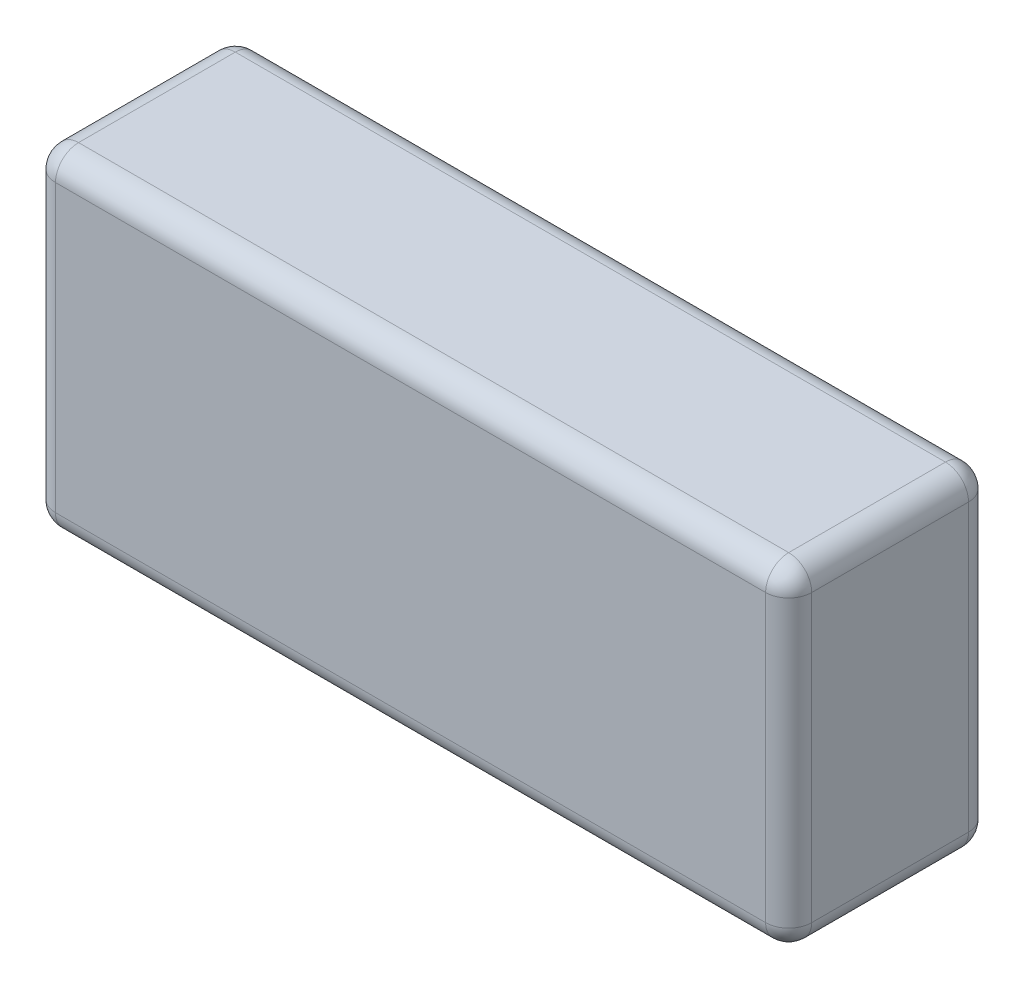
ISO-10303-21;
HEADER;
FILE_DESCRIPTION(('STEP AP214'),'2;1');
FILE_NAME('part.step','',(''),(''),'','','');
FILE_SCHEMA(('AUTOMOTIVE_DESIGN { 1 0 10303 214 1 1 1 1 }'));
ENDSEC;
DATA;
#1=APPLICATION_CONTEXT('core data for automotive mechanical design processes');
#2=APPLICATION_PROTOCOL_DEFINITION('international standard','automotive_design',2000,#1);
#3=PRODUCT_CONTEXT('',#1,'mechanical');
#4=PRODUCT('Part','Part','',(#3));
#5=PRODUCT_RELATED_PRODUCT_CATEGORY('part','',(#4));
#6=PRODUCT_DEFINITION_FORMATION('','',#4);
#7=PRODUCT_DEFINITION_CONTEXT('part definition',#1,'design');
#8=PRODUCT_DEFINITION('design','',#6,#7);
#9=PRODUCT_DEFINITION_SHAPE('','',#8);
#10=(LENGTH_UNIT() NAMED_UNIT(*) SI_UNIT(.MILLI.,.METRE.));
#11=(NAMED_UNIT(*) PLANE_ANGLE_UNIT() SI_UNIT($,.RADIAN.));
#12=(NAMED_UNIT(*) SI_UNIT($,.STERADIAN.) SOLID_ANGLE_UNIT());
#13=UNCERTAINTY_MEASURE_WITH_UNIT(LENGTH_MEASURE(1.E-05),#10,'distance_accuracy_value','');
#14=(GEOMETRIC_REPRESENTATION_CONTEXT(3) GLOBAL_UNCERTAINTY_ASSIGNED_CONTEXT((#13)) GLOBAL_UNIT_ASSIGNED_CONTEXT((#10,
#11,#12)) REPRESENTATION_CONTEXT('',''));
#15=CARTESIAN_POINT('',(0.,0.,0.));
#16=DIRECTION('',(0.,0.,1.));
#17=DIRECTION('',(1.,0.,0.));
#18=AXIS2_PLACEMENT_3D('',#15,#16,#17);
#19=CARTESIAN_POINT('',(0.,0.,22.));
#20=DIRECTION('',(1.,0.,0.));
#21=DIRECTION('',(0.,0.,-1.));
#22=AXIS2_PLACEMENT_3D('',#19,#20,#21);
#23=PLANE('',#22);
#24=DIRECTION('',(0.,0.,-1.));
#25=VECTOR('',#24,1.);
#26=CARTESIAN_POINT('',(0.,2.5,22.));
#27=LINE('',#26,#25);
#28=CARTESIAN_POINT('',(0.,2.5,2.5));
#29=VERTEX_POINT('',#28);
#30=CARTESIAN_POINT('',(0.,2.5,19.5));
#31=VERTEX_POINT('',#30);
#32=EDGE_CURVE('E256',#29,#31,#27,.F.);
#33=ORIENTED_EDGE('',*,*,#32,.T.);
#34=DIRECTION('',(0.,-1.,0.));
#35=VECTOR('',#34,1.);
#36=CARTESIAN_POINT('',(0.,0.,19.5));
#37=LINE('',#36,#35);
#38=CARTESIAN_POINT('',(0.,33.5,19.5));
#39=VERTEX_POINT('',#38);
#40=EDGE_CURVE('E269',#31,#39,#37,.F.);
#41=ORIENTED_EDGE('',*,*,#40,.T.);
#42=DIRECTION('',(0.,0.,-1.));
#43=VECTOR('',#42,1.);
#44=CARTESIAN_POINT('',(0.,33.5,22.));
#45=LINE('',#44,#43);
#46=CARTESIAN_POINT('',(0.,33.5,2.5));
#47=VERTEX_POINT('',#46);
#48=EDGE_CURVE('E262',#39,#47,#45,.T.);
#49=ORIENTED_EDGE('',*,*,#48,.T.);
#50=DIRECTION('',(0.,-1.,0.));
#51=VECTOR('',#50,1.);
#52=CARTESIAN_POINT('',(0.,2.5,2.5));
#53=LINE('',#52,#51);
#54=EDGE_CURVE('E214',#47,#29,#53,.T.);
#55=ORIENTED_EDGE('',*,*,#54,.T.);
#56=EDGE_LOOP('',(#33,#41,#49,#55));
#57=FACE_BOUND('',#56,.T.);
#58=ADVANCED_FACE('F35',(#57),#23,.F.);
#59=CARTESIAN_POINT('',(0.,0.,22.));
#60=DIRECTION('',(0.,1.,0.));
#61=DIRECTION('',(0.,0.,1.));
#62=AXIS2_PLACEMENT_3D('',#59,#60,#61);
#63=PLANE('',#62);
#64=DIRECTION('',(1.,0.,0.));
#65=VECTOR('',#64,1.);
#66=CARTESIAN_POINT('',(82.,0.,2.5));
#67=LINE('',#66,#65);
#68=CARTESIAN_POINT('',(2.5,0.,2.5));
#69=VERTEX_POINT('',#68);
#70=CARTESIAN_POINT('',(79.5,0.,2.5));
#71=VERTEX_POINT('',#70);
#72=EDGE_CURVE('E130',#69,#71,#67,.T.);
#73=ORIENTED_EDGE('',*,*,#72,.T.);
#74=DIRECTION('',(0.,0.,-1.));
#75=VECTOR('',#74,1.);
#76=CARTESIAN_POINT('',(79.5,0.,22.));
#77=LINE('',#76,#75);
#78=CARTESIAN_POINT('',(79.5,0.,19.5));
#79=VERTEX_POINT('',#78);
#80=EDGE_CURVE('E11',#71,#79,#77,.F.);
#81=ORIENTED_EDGE('',*,*,#80,.T.);
#82=DIRECTION('',(1.,0.,0.));
#83=VECTOR('',#82,1.);
#84=CARTESIAN_POINT('',(0.,0.,19.5));
#85=LINE('',#84,#83);
#86=CARTESIAN_POINT('',(2.5,0.,19.5));
#87=VERTEX_POINT('',#86);
#88=EDGE_CURVE('E128',#79,#87,#85,.F.);
#89=ORIENTED_EDGE('',*,*,#88,.T.);
#90=DIRECTION('',(0.,0.,-1.));
#91=VECTOR('',#90,1.);
#92=CARTESIAN_POINT('',(2.5,0.,22.));
#93=LINE('',#92,#91);
#94=EDGE_CURVE('E44',#87,#69,#93,.T.);
#95=ORIENTED_EDGE('',*,*,#94,.T.);
#96=EDGE_LOOP('',(#73,#81,#89,#95));
#97=FACE_BOUND('',#96,.T.);
#98=ADVANCED_FACE('F127',(#97),#63,.F.);
#99=CARTESIAN_POINT('',(82.,0.,22.));
#100=DIRECTION('',(-1.,0.,0.));
#101=DIRECTION('',(0.,0.,1.));
#102=AXIS2_PLACEMENT_3D('',#99,#100,#101);
#103=PLANE('',#102);
#104=DIRECTION('',(0.,0.,-1.));
#105=VECTOR('',#104,1.);
#106=CARTESIAN_POINT('',(82.,33.5,22.));
#107=LINE('',#106,#105);
#108=CARTESIAN_POINT('',(82.,33.5,2.5));
#109=VERTEX_POINT('',#108);
#110=CARTESIAN_POINT('',(82.,33.5,19.5));
#111=VERTEX_POINT('',#110);
#112=EDGE_CURVE('E52',#109,#111,#107,.F.);
#113=ORIENTED_EDGE('',*,*,#112,.T.);
#114=DIRECTION('',(0.,1.,0.));
#115=VECTOR('',#114,1.);
#116=CARTESIAN_POINT('',(82.,0.,19.5));
#117=LINE('',#116,#115);
#118=CARTESIAN_POINT('',(82.,2.5,19.5));
#119=VERTEX_POINT('',#118);
#120=EDGE_CURVE('E239',#111,#119,#117,.F.);
#121=ORIENTED_EDGE('',*,*,#120,.T.);
#122=DIRECTION('',(0.,0.,-1.));
#123=VECTOR('',#122,1.);
#124=CARTESIAN_POINT('',(82.,2.5,22.));
#125=LINE('',#124,#123);
#126=CARTESIAN_POINT('',(82.,2.5,2.5));
#127=VERTEX_POINT('',#126);
#128=EDGE_CURVE('E157',#119,#127,#125,.T.);
#129=ORIENTED_EDGE('',*,*,#128,.T.);
#130=DIRECTION('',(0.,1.,0.));
#131=VECTOR('',#130,1.);
#132=CARTESIAN_POINT('',(82.,33.5,2.5));
#133=LINE('',#132,#131);
#134=EDGE_CURVE('E57',#127,#109,#133,.T.);
#135=ORIENTED_EDGE('',*,*,#134,.T.);
#136=EDGE_LOOP('',(#113,#121,#129,#135));
#137=FACE_BOUND('',#136,.T.);
#138=ADVANCED_FACE('F334',(#137),#103,.F.);
#139=CARTESIAN_POINT('',(0.,36.,22.));
#140=DIRECTION('',(0.,-1.,0.));
#141=DIRECTION('',(0.,0.,-1.));
#142=AXIS2_PLACEMENT_3D('',#139,#140,#141);
#143=PLANE('',#142);
#144=DIRECTION('',(-1.,0.,0.));
#145=VECTOR('',#144,1.);
#146=CARTESIAN_POINT('',(0.,36.,2.5));
#147=LINE('',#146,#145);
#148=CARTESIAN_POINT('',(79.5,36.,2.5));
#149=VERTEX_POINT('',#148);
#150=CARTESIAN_POINT('',(2.5,36.,2.5));
#151=VERTEX_POINT('',#150);
#152=EDGE_CURVE('E153',#149,#151,#147,.T.);
#153=ORIENTED_EDGE('',*,*,#152,.T.);
#154=DIRECTION('',(0.,0.,-1.));
#155=VECTOR('',#154,1.);
#156=CARTESIAN_POINT('',(2.5,36.,22.));
#157=LINE('',#156,#155);
#158=CARTESIAN_POINT('',(2.5,36.,19.5));
#159=VERTEX_POINT('',#158);
#160=EDGE_CURVE('E227',#151,#159,#157,.F.);
#161=ORIENTED_EDGE('',*,*,#160,.T.);
#162=DIRECTION('',(-1.,0.,0.));
#163=VECTOR('',#162,1.);
#164=CARTESIAN_POINT('',(0.,36.,19.5));
#165=LINE('',#164,#163);
#166=CARTESIAN_POINT('',(79.5,36.,19.5));
#167=VERTEX_POINT('',#166);
#168=EDGE_CURVE('E280',#159,#167,#165,.F.);
#169=ORIENTED_EDGE('',*,*,#168,.T.);
#170=DIRECTION('',(0.,0.,-1.));
#171=VECTOR('',#170,1.);
#172=CARTESIAN_POINT('',(79.5,36.,22.));
#173=LINE('',#172,#171);
#174=EDGE_CURVE('E275',#167,#149,#173,.T.);
#175=ORIENTED_EDGE('',*,*,#174,.T.);
#176=EDGE_LOOP('',(#153,#161,#169,#175));
#177=FACE_BOUND('',#176,.T.);
#178=ADVANCED_FACE('F279',(#177),#143,.F.);
#179=CARTESIAN_POINT('',(0.,0.,22.));
#180=DIRECTION('',(0.,0.,-1.));
#181=DIRECTION('',(-1.,0.,0.));
#182=AXIS2_PLACEMENT_3D('',#179,#180,#181);
#183=PLANE('',#182);
#184=DIRECTION('',(-1.,0.,0.));
#185=VECTOR('',#184,1.);
#186=CARTESIAN_POINT('',(0.,33.5,22.));
#187=LINE('',#186,#185);
#188=CARTESIAN_POINT('',(79.5,33.5,22.));
#189=VERTEX_POINT('',#188);
#190=CARTESIAN_POINT('',(2.5,33.5,22.));
#191=VERTEX_POINT('',#190);
#192=EDGE_CURVE('E299',#189,#191,#187,.T.);
#193=ORIENTED_EDGE('',*,*,#192,.T.);
#194=DIRECTION('',(0.,-1.,0.));
#195=VECTOR('',#194,1.);
#196=CARTESIAN_POINT('',(2.5,0.,22.));
#197=LINE('',#196,#195);
#198=CARTESIAN_POINT('',(2.5,2.5,22.));
#199=VERTEX_POINT('',#198);
#200=EDGE_CURVE('E260',#191,#199,#197,.T.);
#201=ORIENTED_EDGE('',*,*,#200,.T.);
#202=DIRECTION('',(1.,0.,0.));
#203=VECTOR('',#202,1.);
#204=CARTESIAN_POINT('',(0.,2.5,22.));
#205=LINE('',#204,#203);
#206=CARTESIAN_POINT('',(79.5,2.5,22.));
#207=VERTEX_POINT('',#206);
#208=EDGE_CURVE('E288',#199,#207,#205,.T.);
#209=ORIENTED_EDGE('',*,*,#208,.T.);
#210=DIRECTION('',(0.,1.,0.));
#211=VECTOR('',#210,1.);
#212=CARTESIAN_POINT('',(79.5,0.,22.));
#213=LINE('',#212,#211);
#214=EDGE_CURVE('E264',#207,#189,#213,.T.);
#215=ORIENTED_EDGE('',*,*,#214,.T.);
#216=EDGE_LOOP('',(#193,#201,#209,#215));
#217=FACE_BOUND('',#216,.T.);
#218=ADVANCED_FACE('F298',(#217),#183,.F.);
#219=CARTESIAN_POINT('',(0.,0.,0.));
#220=DIRECTION('',(0.,0.,-1.));
#221=DIRECTION('',(-1.,0.,0.));
#222=AXIS2_PLACEMENT_3D('',#219,#220,#221);
#223=PLANE('',#222);
#224=DIRECTION('',(1.,0.,0.));
#225=VECTOR('',#224,1.);
#226=CARTESIAN_POINT('',(0.,2.5,0.));
#227=LINE('',#226,#225);
#228=CARTESIAN_POINT('',(79.5,2.5,0.));
#229=VERTEX_POINT('',#228);
#230=CARTESIAN_POINT('',(2.5,2.5,0.));
#231=VERTEX_POINT('',#230);
#232=EDGE_CURVE('E306',#229,#231,#227,.F.);
#233=ORIENTED_EDGE('',*,*,#232,.T.);
#234=DIRECTION('',(0.,-1.,0.));
#235=VECTOR('',#234,1.);
#236=CARTESIAN_POINT('',(2.5,33.5,0.));
#237=LINE('',#236,#235);
#238=CARTESIAN_POINT('',(2.5,33.5,0.));
#239=VERTEX_POINT('',#238);
#240=EDGE_CURVE('E213',#231,#239,#237,.F.);
#241=ORIENTED_EDGE('',*,*,#240,.T.);
#242=DIRECTION('',(-1.,0.,0.));
#243=VECTOR('',#242,1.);
#244=CARTESIAN_POINT('',(82.,33.5,0.));
#245=LINE('',#244,#243);
#246=CARTESIAN_POINT('',(79.5,33.5,0.));
#247=VERTEX_POINT('',#246);
#248=EDGE_CURVE('E249',#239,#247,#245,.F.);
#249=ORIENTED_EDGE('',*,*,#248,.T.);
#250=DIRECTION('',(0.,1.,0.));
#251=VECTOR('',#250,1.);
#252=CARTESIAN_POINT('',(79.5,2.5,0.));
#253=LINE('',#252,#251);
#254=EDGE_CURVE('E223',#247,#229,#253,.F.);
#255=ORIENTED_EDGE('',*,*,#254,.T.);
#256=EDGE_LOOP('',(#233,#241,#249,#255));
#257=FACE_BOUND('',#256,.T.);
#258=ADVANCED_FACE('F310',(#257),#223,.T.);
#259=CARTESIAN_POINT('',(0.,2.5,2.5));
#260=DIRECTION('',(-1.,0.,0.));
#261=DIRECTION('',(0.,0.,1.));
#262=AXIS2_PLACEMENT_3D('',#259,#260,#261);
#263=CYLINDRICAL_SURFACE('',#262,2.5);
#264=ORIENTED_EDGE('',*,*,#72,.F.);
#265=CARTESIAN_POINT('',(2.5,2.5,2.5));
#266=DIRECTION('',(-1.,0.,0.));
#267=DIRECTION('',(0.,0.,1.));
#268=AXIS2_PLACEMENT_3D('',#265,#266,#267);
#269=CIRCLE('',#268,2.5);
#270=EDGE_CURVE('E234',#69,#231,#269,.F.);
#271=ORIENTED_EDGE('',*,*,#270,.T.);
#272=ORIENTED_EDGE('',*,*,#232,.F.);
#273=CARTESIAN_POINT('',(79.5,2.5,2.5));
#274=DIRECTION('',(-1.,0.,0.));
#275=DIRECTION('',(0.,0.,1.));
#276=AXIS2_PLACEMENT_3D('',#273,#274,#275);
#277=CIRCLE('',#276,2.5);
#278=EDGE_CURVE('E232',#229,#71,#277,.T.);
#279=ORIENTED_EDGE('',*,*,#278,.T.);
#280=EDGE_LOOP('',(#264,#271,#272,#279));
#281=FACE_BOUND('',#280,.T.);
#282=ADVANCED_FACE('F245',(#281),#263,.T.);
#283=CARTESIAN_POINT('',(0.,2.5,19.5));
#284=DIRECTION('',(1.,0.,0.));
#285=DIRECTION('',(0.,0.,-1.));
#286=AXIS2_PLACEMENT_3D('',#283,#284,#285);
#287=CYLINDRICAL_SURFACE('',#286,2.5);
#288=ORIENTED_EDGE('',*,*,#208,.F.);
#289=CARTESIAN_POINT('',(2.5,2.5,19.5));
#290=DIRECTION('',(1.,0.,0.));
#291=DIRECTION('',(0.,0.,-1.));
#292=AXIS2_PLACEMENT_3D('',#289,#290,#291);
#293=CIRCLE('',#292,2.5);
#294=EDGE_CURVE('E144',#199,#87,#293,.T.);
#295=ORIENTED_EDGE('',*,*,#294,.T.);
#296=ORIENTED_EDGE('',*,*,#88,.F.);
#297=CARTESIAN_POINT('',(79.5,2.5,19.5));
#298=DIRECTION('',(1.,0.,0.));
#299=DIRECTION('',(0.,0.,-1.));
#300=AXIS2_PLACEMENT_3D('',#297,#298,#299);
#301=CIRCLE('',#300,2.5);
#302=EDGE_CURVE('E141',#79,#207,#301,.F.);
#303=ORIENTED_EDGE('',*,*,#302,.T.);
#304=EDGE_LOOP('',(#288,#295,#296,#303));
#305=FACE_BOUND('',#304,.T.);
#306=ADVANCED_FACE('F140',(#305),#287,.T.);
#307=CARTESIAN_POINT('',(0.,33.5,2.5));
#308=DIRECTION('',(1.,0.,0.));
#309=DIRECTION('',(0.,0.,-1.));
#310=AXIS2_PLACEMENT_3D('',#307,#308,#309);
#311=CYLINDRICAL_SURFACE('',#310,2.5);
#312=ORIENTED_EDGE('',*,*,#248,.F.);
#313=CARTESIAN_POINT('',(2.5,33.5,2.5));
#314=DIRECTION('',(1.,0.,0.));
#315=DIRECTION('',(0.,0.,-1.));
#316=AXIS2_PLACEMENT_3D('',#313,#314,#315);
#317=CIRCLE('',#316,2.5);
#318=EDGE_CURVE('E218',#239,#151,#317,.T.);
#319=ORIENTED_EDGE('',*,*,#318,.T.);
#320=ORIENTED_EDGE('',*,*,#152,.F.);
#321=CARTESIAN_POINT('',(79.5,33.5,2.5));
#322=DIRECTION('',(1.,0.,0.));
#323=DIRECTION('',(0.,0.,-1.));
#324=AXIS2_PLACEMENT_3D('',#321,#322,#323);
#325=CIRCLE('',#324,2.5);
#326=EDGE_CURVE('E224',#149,#247,#325,.F.);
#327=ORIENTED_EDGE('',*,*,#326,.T.);
#328=EDGE_LOOP('',(#312,#319,#320,#327));
#329=FACE_BOUND('',#328,.T.);
#330=ADVANCED_FACE('F342',(#329),#311,.T.);
#331=CARTESIAN_POINT('',(0.,33.5,19.5));
#332=DIRECTION('',(-1.,0.,0.));
#333=DIRECTION('',(0.,0.,1.));
#334=AXIS2_PLACEMENT_3D('',#331,#332,#333);
#335=CYLINDRICAL_SURFACE('',#334,2.5);
#336=ORIENTED_EDGE('',*,*,#168,.F.);
#337=CARTESIAN_POINT('',(2.5,33.5,19.5));
#338=DIRECTION('',(-1.,0.,0.));
#339=DIRECTION('',(0.,0.,1.));
#340=AXIS2_PLACEMENT_3D('',#337,#338,#339);
#341=CIRCLE('',#340,2.5);
#342=EDGE_CURVE('E273',#159,#191,#341,.F.);
#343=ORIENTED_EDGE('',*,*,#342,.T.);
#344=ORIENTED_EDGE('',*,*,#192,.F.);
#345=CARTESIAN_POINT('',(79.5,33.5,19.5));
#346=DIRECTION('',(-1.,0.,0.));
#347=DIRECTION('',(0.,0.,1.));
#348=AXIS2_PLACEMENT_3D('',#345,#346,#347);
#349=CIRCLE('',#348,2.5);
#350=EDGE_CURVE('E271',#189,#167,#349,.T.);
#351=ORIENTED_EDGE('',*,*,#350,.T.);
#352=EDGE_LOOP('',(#336,#343,#344,#351));
#353=FACE_BOUND('',#352,.T.);
#354=ADVANCED_FACE('F283',(#353),#335,.T.);
#355=CARTESIAN_POINT('',(2.5,33.5,2.5));
#356=DIRECTION('',(0.,0.,1.));
#357=DIRECTION('',(1.,0.,0.));
#358=AXIS2_PLACEMENT_3D('',#355,#356,#357);
#359=SPHERICAL_SURFACE('',#358,2.5);
#360=CARTESIAN_POINT('',(2.5,33.5,2.5));
#361=DIRECTION('',(0.,0.,1.));
#362=DIRECTION('',(1.,0.,0.));
#363=AXIS2_PLACEMENT_3D('',#360,#361,#362);
#364=CIRCLE('',#363,2.5);
#365=EDGE_CURVE('E200',#151,#47,#364,.T.);
#366=ORIENTED_EDGE('',*,*,#365,.F.);
#367=ORIENTED_EDGE('',*,*,#318,.F.);
#368=CARTESIAN_POINT('',(2.5,33.5,2.5));
#369=DIRECTION('',(0.,-1.,0.));
#370=DIRECTION('',(0.,0.,-1.));
#371=AXIS2_PLACEMENT_3D('',#368,#369,#370);
#372=CIRCLE('',#371,2.5);
#373=EDGE_CURVE('E145',#47,#239,#372,.T.);
#374=ORIENTED_EDGE('',*,*,#373,.F.);
#375=EDGE_LOOP('',(#366,#367,#374));
#376=FACE_BOUND('',#375,.T.);
#377=ADVANCED_FACE('F217',(#376),#359,.T.);
#378=CARTESIAN_POINT('',(2.5,0.,2.5));
#379=DIRECTION('',(0.,1.,0.));
#380=DIRECTION('',(0.,0.,1.));
#381=AXIS2_PLACEMENT_3D('',#378,#379,#380);
#382=CYLINDRICAL_SURFACE('',#381,2.5);
#383=ORIENTED_EDGE('',*,*,#373,.T.);
#384=ORIENTED_EDGE('',*,*,#240,.F.);
#385=CARTESIAN_POINT('',(2.5,2.5,2.5));
#386=DIRECTION('',(0.,-1.,0.));
#387=DIRECTION('',(0.,0.,-1.));
#388=AXIS2_PLACEMENT_3D('',#385,#386,#387);
#389=CIRCLE('',#388,2.5);
#390=EDGE_CURVE('E198',#29,#231,#389,.T.);
#391=ORIENTED_EDGE('',*,*,#390,.F.);
#392=ORIENTED_EDGE('',*,*,#54,.F.);
#393=EDGE_LOOP('',(#383,#384,#391,#392));
#394=FACE_BOUND('',#393,.T.);
#395=ADVANCED_FACE('F211',(#394),#382,.T.);
#396=CARTESIAN_POINT('',(2.5,33.5,22.));
#397=DIRECTION('',(0.,0.,-1.));
#398=DIRECTION('',(-1.,0.,0.));
#399=AXIS2_PLACEMENT_3D('',#396,#397,#398);
#400=CYLINDRICAL_SURFACE('',#399,2.5);
#401=ORIENTED_EDGE('',*,*,#365,.T.);
#402=ORIENTED_EDGE('',*,*,#48,.F.);
#403=CARTESIAN_POINT('',(2.5,33.5,19.5));
#404=DIRECTION('',(0.,0.,1.));
#405=DIRECTION('',(1.,0.,0.));
#406=AXIS2_PLACEMENT_3D('',#403,#404,#405);
#407=CIRCLE('',#406,2.5);
#408=EDGE_CURVE('E195',#159,#39,#407,.T.);
#409=ORIENTED_EDGE('',*,*,#408,.F.);
#410=ORIENTED_EDGE('',*,*,#160,.F.);
#411=EDGE_LOOP('',(#401,#402,#409,#410));
#412=FACE_BOUND('',#411,.T.);
#413=ADVANCED_FACE('F290',(#412),#400,.T.);
#414=CARTESIAN_POINT('',(2.5,2.5,2.5));
#415=DIRECTION('',(0.,0.,1.));
#416=DIRECTION('',(1.,0.,0.));
#417=AXIS2_PLACEMENT_3D('',#414,#415,#416);
#418=SPHERICAL_SURFACE('',#417,2.5);
#419=ORIENTED_EDGE('',*,*,#390,.T.);
#420=ORIENTED_EDGE('',*,*,#270,.F.);
#421=CARTESIAN_POINT('',(2.5,2.5,2.5));
#422=DIRECTION('',(0.,0.,1.));
#423=DIRECTION('',(1.,0.,0.));
#424=AXIS2_PLACEMENT_3D('',#421,#422,#423);
#425=CIRCLE('',#424,2.5);
#426=EDGE_CURVE('E192',#29,#69,#425,.T.);
#427=ORIENTED_EDGE('',*,*,#426,.F.);
#428=EDGE_LOOP('',(#419,#420,#427));
#429=FACE_BOUND('',#428,.T.);
#430=ADVANCED_FACE('F253',(#429),#418,.T.);
#431=CARTESIAN_POINT('',(2.5,33.5,19.5));
#432=DIRECTION('',(0.,0.,1.));
#433=DIRECTION('',(1.,0.,0.));
#434=AXIS2_PLACEMENT_3D('',#431,#432,#433);
#435=SPHERICAL_SURFACE('',#434,2.5);
#436=ORIENTED_EDGE('',*,*,#342,.F.);
#437=ORIENTED_EDGE('',*,*,#408,.T.);
#438=CARTESIAN_POINT('',(2.5,33.5,19.5));
#439=DIRECTION('',(0.,-1.,0.));
#440=DIRECTION('',(0.,0.,-1.));
#441=AXIS2_PLACEMENT_3D('',#438,#439,#440);
#442=CIRCLE('',#441,2.5);
#443=EDGE_CURVE('E187',#191,#39,#442,.T.);
#444=ORIENTED_EDGE('',*,*,#443,.F.);
#445=EDGE_LOOP('',(#436,#437,#444));
#446=FACE_BOUND('',#445,.T.);
#447=ADVANCED_FACE('F293',(#446),#435,.T.);
#448=CARTESIAN_POINT('',(2.5,2.5,22.));
#449=DIRECTION('',(0.,0.,-1.));
#450=DIRECTION('',(-1.,0.,0.));
#451=AXIS2_PLACEMENT_3D('',#448,#449,#450);
#452=CYLINDRICAL_SURFACE('',#451,2.5);
#453=ORIENTED_EDGE('',*,*,#426,.T.);
#454=ORIENTED_EDGE('',*,*,#94,.F.);
#455=CARTESIAN_POINT('',(2.5,2.5,19.5));
#456=DIRECTION('',(0.,0.,1.));
#457=DIRECTION('',(1.,0.,0.));
#458=AXIS2_PLACEMENT_3D('',#455,#456,#457);
#459=CIRCLE('',#458,2.5);
#460=EDGE_CURVE('E183',#31,#87,#459,.T.);
#461=ORIENTED_EDGE('',*,*,#460,.F.);
#462=ORIENTED_EDGE('',*,*,#32,.F.);
#463=EDGE_LOOP('',(#453,#454,#461,#462));
#464=FACE_BOUND('',#463,.T.);
#465=ADVANCED_FACE('F255',(#464),#452,.T.);
#466=CARTESIAN_POINT('',(2.5,0.,19.5));
#467=DIRECTION('',(0.,-1.,0.));
#468=DIRECTION('',(0.,0.,-1.));
#469=AXIS2_PLACEMENT_3D('',#466,#467,#468);
#470=CYLINDRICAL_SURFACE('',#469,2.5);
#471=ORIENTED_EDGE('',*,*,#443,.T.);
#472=ORIENTED_EDGE('',*,*,#40,.F.);
#473=CARTESIAN_POINT('',(2.5,2.5,19.5));
#474=DIRECTION('',(0.,-1.,0.));
#475=DIRECTION('',(0.,0.,-1.));
#476=AXIS2_PLACEMENT_3D('',#473,#474,#475);
#477=CIRCLE('',#476,2.5);
#478=EDGE_CURVE('E179',#199,#31,#477,.T.);
#479=ORIENTED_EDGE('',*,*,#478,.F.);
#480=ORIENTED_EDGE('',*,*,#200,.F.);
#481=EDGE_LOOP('',(#471,#472,#479,#480));
#482=FACE_BOUND('',#481,.T.);
#483=ADVANCED_FACE('F296',(#482),#470,.T.);
#484=CARTESIAN_POINT('',(2.5,2.5,19.5));
#485=DIRECTION('',(0.,0.,1.));
#486=DIRECTION('',(1.,0.,0.));
#487=AXIS2_PLACEMENT_3D('',#484,#485,#486);
#488=SPHERICAL_SURFACE('',#487,2.5);
#489=ORIENTED_EDGE('',*,*,#460,.T.);
#490=ORIENTED_EDGE('',*,*,#294,.F.);
#491=ORIENTED_EDGE('',*,*,#478,.T.);
#492=EDGE_LOOP('',(#489,#490,#491));
#493=FACE_BOUND('',#492,.T.);
#494=ADVANCED_FACE('F301',(#493),#488,.T.);
#495=CARTESIAN_POINT('',(79.5,33.5,2.5));
#496=DIRECTION('',(0.,0.,1.));
#497=DIRECTION('',(1.,0.,0.));
#498=AXIS2_PLACEMENT_3D('',#495,#496,#497);
#499=SPHERICAL_SURFACE('',#498,2.5);
#500=CARTESIAN_POINT('',(79.5,33.5,2.5));
#501=DIRECTION('',(0.,-1.,0.));
#502=DIRECTION('',(0.,0.,-1.));
#503=AXIS2_PLACEMENT_3D('',#500,#501,#502);
#504=CIRCLE('',#503,2.5);
#505=EDGE_CURVE('E173',#247,#109,#504,.T.);
#506=ORIENTED_EDGE('',*,*,#505,.F.);
#507=ORIENTED_EDGE('',*,*,#326,.F.);
#508=CARTESIAN_POINT('',(79.5,33.5,2.5));
#509=DIRECTION('',(0.,0.,1.));
#510=DIRECTION('',(1.,0.,0.));
#511=AXIS2_PLACEMENT_3D('',#508,#509,#510);
#512=CIRCLE('',#511,2.5);
#513=EDGE_CURVE('E39',#109,#149,#512,.T.);
#514=ORIENTED_EDGE('',*,*,#513,.F.);
#515=EDGE_LOOP('',(#506,#507,#514));
#516=FACE_BOUND('',#515,.T.);
#517=ADVANCED_FACE('F37',(#516),#499,.T.);
#518=CARTESIAN_POINT('',(79.5,33.5,22.));
#519=DIRECTION('',(0.,0.,-1.));
#520=DIRECTION('',(-1.,0.,0.));
#521=AXIS2_PLACEMENT_3D('',#518,#519,#520);
#522=CYLINDRICAL_SURFACE('',#521,2.5);
#523=ORIENTED_EDGE('',*,*,#513,.T.);
#524=ORIENTED_EDGE('',*,*,#174,.F.);
#525=CARTESIAN_POINT('',(79.5,33.5,19.5));
#526=DIRECTION('',(0.,0.,1.));
#527=DIRECTION('',(1.,0.,0.));
#528=AXIS2_PLACEMENT_3D('',#525,#526,#527);
#529=CIRCLE('',#528,2.5);
#530=EDGE_CURVE('E171',#111,#167,#529,.T.);
#531=ORIENTED_EDGE('',*,*,#530,.F.);
#532=ORIENTED_EDGE('',*,*,#112,.F.);
#533=EDGE_LOOP('',(#523,#524,#531,#532));
#534=FACE_BOUND('',#533,.T.);
#535=ADVANCED_FACE('F407',(#534),#522,.T.);
#536=CARTESIAN_POINT('',(79.5,0.,2.5));
#537=DIRECTION('',(0.,-1.,0.));
#538=DIRECTION('',(0.,0.,-1.));
#539=AXIS2_PLACEMENT_3D('',#536,#537,#538);
#540=CYLINDRICAL_SURFACE('',#539,2.5);
#541=ORIENTED_EDGE('',*,*,#505,.T.);
#542=ORIENTED_EDGE('',*,*,#134,.F.);
#543=CARTESIAN_POINT('',(79.5,2.5,2.5));
#544=DIRECTION('',(0.,-1.,0.));
#545=DIRECTION('',(0.,0.,-1.));
#546=AXIS2_PLACEMENT_3D('',#543,#544,#545);
#547=CIRCLE('',#546,2.5);
#548=EDGE_CURVE('E168',#229,#127,#547,.T.);
#549=ORIENTED_EDGE('',*,*,#548,.F.);
#550=ORIENTED_EDGE('',*,*,#254,.F.);
#551=EDGE_LOOP('',(#541,#542,#549,#550));
#552=FACE_BOUND('',#551,.T.);
#553=ADVANCED_FACE('F314',(#552),#540,.T.);
#554=CARTESIAN_POINT('',(79.5,33.5,19.5));
#555=DIRECTION('',(0.,0.,1.));
#556=DIRECTION('',(1.,0.,0.));
#557=AXIS2_PLACEMENT_3D('',#554,#555,#556);
#558=SPHERICAL_SURFACE('',#557,2.5);
#559=ORIENTED_EDGE('',*,*,#530,.T.);
#560=ORIENTED_EDGE('',*,*,#350,.F.);
#561=CARTESIAN_POINT('',(79.5,33.5,19.5));
#562=DIRECTION('',(0.,-1.,0.));
#563=DIRECTION('',(0.,0.,-1.));
#564=AXIS2_PLACEMENT_3D('',#561,#562,#563);
#565=CIRCLE('',#564,2.5);
#566=EDGE_CURVE('E165',#111,#189,#565,.T.);
#567=ORIENTED_EDGE('',*,*,#566,.F.);
#568=EDGE_LOOP('',(#559,#560,#567));
#569=FACE_BOUND('',#568,.T.);
#570=ADVANCED_FACE('F319',(#569),#558,.T.);
#571=CARTESIAN_POINT('',(79.5,2.5,2.5));
#572=DIRECTION('',(0.,0.,1.));
#573=DIRECTION('',(1.,0.,0.));
#574=AXIS2_PLACEMENT_3D('',#571,#572,#573);
#575=SPHERICAL_SURFACE('',#574,2.5);
#576=ORIENTED_EDGE('',*,*,#278,.F.);
#577=ORIENTED_EDGE('',*,*,#548,.T.);
#578=CARTESIAN_POINT('',(79.5,2.5,2.5));
#579=DIRECTION('',(0.,0.,1.));
#580=DIRECTION('',(1.,0.,0.));
#581=AXIS2_PLACEMENT_3D('',#578,#579,#580);
#582=CIRCLE('',#581,2.5);
#583=EDGE_CURVE('E159',#71,#127,#582,.T.);
#584=ORIENTED_EDGE('',*,*,#583,.F.);
#585=EDGE_LOOP('',(#576,#577,#584));
#586=FACE_BOUND('',#585,.T.);
#587=ADVANCED_FACE('F316',(#586),#575,.T.);
#588=CARTESIAN_POINT('',(79.5,0.,19.5));
#589=DIRECTION('',(0.,1.,0.));
#590=DIRECTION('',(0.,0.,1.));
#591=AXIS2_PLACEMENT_3D('',#588,#589,#590);
#592=CYLINDRICAL_SURFACE('',#591,2.5);
#593=ORIENTED_EDGE('',*,*,#566,.T.);
#594=ORIENTED_EDGE('',*,*,#214,.F.);
#595=CARTESIAN_POINT('',(79.5,2.5,19.5));
#596=DIRECTION('',(0.,-1.,0.));
#597=DIRECTION('',(0.,0.,-1.));
#598=AXIS2_PLACEMENT_3D('',#595,#596,#597);
#599=CIRCLE('',#598,2.5);
#600=EDGE_CURVE('E151',#119,#207,#599,.T.);
#601=ORIENTED_EDGE('',*,*,#600,.F.);
#602=ORIENTED_EDGE('',*,*,#120,.F.);
#603=EDGE_LOOP('',(#593,#594,#601,#602));
#604=FACE_BOUND('',#603,.T.);
#605=ADVANCED_FACE('F318',(#604),#592,.T.);
#606=CARTESIAN_POINT('',(79.5,2.5,22.));
#607=DIRECTION('',(0.,0.,-1.));
#608=DIRECTION('',(-1.,0.,0.));
#609=AXIS2_PLACEMENT_3D('',#606,#607,#608);
#610=CYLINDRICAL_SURFACE('',#609,2.5);
#611=ORIENTED_EDGE('',*,*,#583,.T.);
#612=ORIENTED_EDGE('',*,*,#128,.F.);
#613=CARTESIAN_POINT('',(79.5,2.5,19.5));
#614=DIRECTION('',(0.,0.,1.));
#615=DIRECTION('',(1.,0.,0.));
#616=AXIS2_PLACEMENT_3D('',#613,#614,#615);
#617=CIRCLE('',#616,2.5);
#618=EDGE_CURVE('E149',#79,#119,#617,.T.);
#619=ORIENTED_EDGE('',*,*,#618,.F.);
#620=ORIENTED_EDGE('',*,*,#80,.F.);
#621=EDGE_LOOP('',(#611,#612,#619,#620));
#622=FACE_BOUND('',#621,.T.);
#623=ADVANCED_FACE('F156',(#622),#610,.T.);
#624=CARTESIAN_POINT('',(79.5,2.5,19.5));
#625=DIRECTION('',(0.,0.,1.));
#626=DIRECTION('',(1.,0.,0.));
#627=AXIS2_PLACEMENT_3D('',#624,#625,#626);
#628=SPHERICAL_SURFACE('',#627,2.5);
#629=ORIENTED_EDGE('',*,*,#600,.T.);
#630=ORIENTED_EDGE('',*,*,#302,.F.);
#631=ORIENTED_EDGE('',*,*,#618,.T.);
#632=EDGE_LOOP('',(#629,#630,#631));
#633=FACE_BOUND('',#632,.T.);
#634=ADVANCED_FACE('F148',(#633),#628,.T.);
#635=CLOSED_SHELL('',(#58,#98,#138,#178,#218,#258,#282,#306,#330,#354,#377,#395,#413,#430,#447,
#465,#483,#494,#517,#535,#553,#570,#587,#605,#623,#634));
#636=MANIFOLD_SOLID_BREP('B2',#635);
#637=ADVANCED_BREP_SHAPE_REPRESENTATION('',(#18,#636),#14);
#638=SHAPE_DEFINITION_REPRESENTATION(#9,#637);
ENDSEC;
END-ISO-10303-21;
